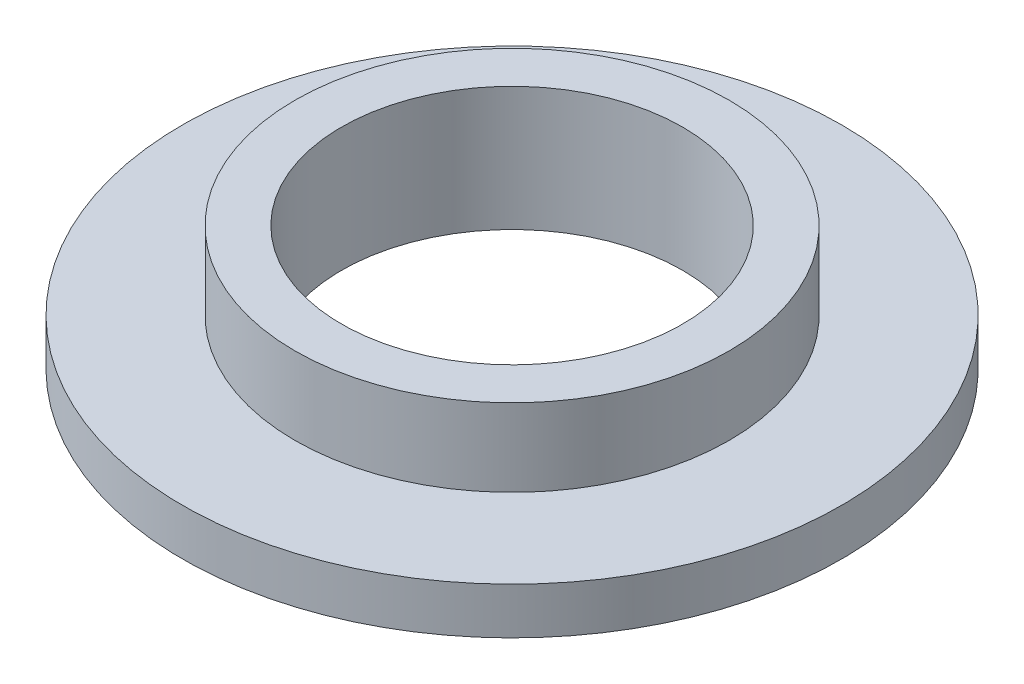
ISO-10303-21;
HEADER;
FILE_DESCRIPTION(('STEP AP214'),'2;1');
FILE_NAME('part.step','',(''),(''),'','','');
FILE_SCHEMA(('AUTOMOTIVE_DESIGN { 1 0 10303 214 1 1 1 1 }'));
ENDSEC;
DATA;
#1=APPLICATION_CONTEXT('core data for automotive mechanical design processes');
#2=APPLICATION_PROTOCOL_DEFINITION('international standard','automotive_design',2000,#1);
#3=PRODUCT_CONTEXT('',#1,'mechanical');
#4=PRODUCT('Part','Part','',(#3));
#5=PRODUCT_RELATED_PRODUCT_CATEGORY('part','',(#4));
#6=PRODUCT_DEFINITION_FORMATION('','',#4);
#7=PRODUCT_DEFINITION_CONTEXT('part definition',#1,'design');
#8=PRODUCT_DEFINITION('design','',#6,#7);
#9=PRODUCT_DEFINITION_SHAPE('','',#8);
#10=(LENGTH_UNIT() NAMED_UNIT(*) SI_UNIT(.MILLI.,.METRE.));
#11=(NAMED_UNIT(*) PLANE_ANGLE_UNIT() SI_UNIT($,.RADIAN.));
#12=(NAMED_UNIT(*) SI_UNIT($,.STERADIAN.) SOLID_ANGLE_UNIT());
#13=UNCERTAINTY_MEASURE_WITH_UNIT(LENGTH_MEASURE(1.E-05),#10,'distance_accuracy_value','');
#14=(GEOMETRIC_REPRESENTATION_CONTEXT(3) GLOBAL_UNCERTAINTY_ASSIGNED_CONTEXT((#13)) GLOBAL_UNIT_ASSIGNED_CONTEXT((#10,
#11,#12)) REPRESENTATION_CONTEXT('',''));
#15=CARTESIAN_POINT('',(0.,0.,0.));
#16=DIRECTION('',(0.,0.,1.));
#17=DIRECTION('',(1.,0.,0.));
#18=AXIS2_PLACEMENT_3D('',#15,#16,#17);
#19=CARTESIAN_POINT('',(-5.3975,0.,0.));
#20=DIRECTION('',(0.,1.,0.));
#21=DIRECTION('',(0.,0.,1.));
#22=AXIS2_PLACEMENT_3D('',#19,#20,#21);
#23=PLANE('',#22);
#24=CARTESIAN_POINT('',(0.,0.,0.));
#25=DIRECTION('',(0.,-1.,0.));
#26=DIRECTION('',(0.,0.,-1.));
#27=AXIS2_PLACEMENT_3D('',#24,#25,#26);
#28=CIRCLE('',#27,2.794);
#29=CARTESIAN_POINT('',(0.,0.,-2.794));
#30=VERTEX_POINT('',#29);
#31=EDGE_CURVE('E10',#30,#30,#28,.T.);
#32=ORIENTED_EDGE('',*,*,#31,.F.);
#33=EDGE_LOOP('',(#32));
#34=FACE_BOUND('',#33,.T.);
#35=CARTESIAN_POINT('',(0.,0.,0.));
#36=DIRECTION('',(0.,-1.,0.));
#37=DIRECTION('',(0.,0.,-1.));
#38=AXIS2_PLACEMENT_3D('',#35,#36,#37);
#39=CIRCLE('',#38,5.3975);
#40=CARTESIAN_POINT('',(0.,0.,-5.3975));
#41=VERTEX_POINT('',#40);
#42=EDGE_CURVE('E70',#41,#41,#39,.T.);
#43=ORIENTED_EDGE('',*,*,#42,.T.);
#44=EDGE_LOOP('',(#43));
#45=FACE_BOUND('',#44,.T.);
#46=ADVANCED_FACE('F43',(#34,#45),#23,.F.);
#47=CARTESIAN_POINT('',(0.,0.,0.));
#48=DIRECTION('',(0.,-1.,0.));
#49=DIRECTION('',(0.,0.,-1.));
#50=AXIS2_PLACEMENT_3D('',#47,#48,#49);
#51=CYLINDRICAL_SURFACE('',#50,2.794);
#52=CARTESIAN_POINT('',(0.,2.032,0.));
#53=DIRECTION('',(0.,-1.,0.));
#54=DIRECTION('',(0.,0.,-1.));
#55=AXIS2_PLACEMENT_3D('',#52,#53,#54);
#56=CIRCLE('',#55,2.794);
#57=CARTESIAN_POINT('',(0.,2.032,-2.794));
#58=VERTEX_POINT('',#57);
#59=EDGE_CURVE('E50',#58,#58,#56,.T.);
#60=ORIENTED_EDGE('',*,*,#59,.F.);
#61=EDGE_LOOP('',(#60));
#62=FACE_BOUND('',#61,.T.);
#63=ORIENTED_EDGE('',*,*,#31,.T.);
#64=EDGE_LOOP('',(#63));
#65=FACE_BOUND('',#64,.T.);
#66=ADVANCED_FACE('F96',(#62,#65),#51,.F.);
#67=CARTESIAN_POINT('',(-2.794,2.032,0.));
#68=DIRECTION('',(0.,-1.,0.));
#69=DIRECTION('',(0.,0.,-1.));
#70=AXIS2_PLACEMENT_3D('',#67,#68,#69);
#71=PLANE('',#70);
#72=CARTESIAN_POINT('',(0.,2.032,0.));
#73=DIRECTION('',(0.,-1.,0.));
#74=DIRECTION('',(0.,0.,-1.));
#75=AXIS2_PLACEMENT_3D('',#72,#73,#74);
#76=CIRCLE('',#75,3.556);
#77=CARTESIAN_POINT('',(0.,2.032,-3.556));
#78=VERTEX_POINT('',#77);
#79=EDGE_CURVE('E55',#78,#78,#76,.T.);
#80=ORIENTED_EDGE('',*,*,#79,.F.);
#81=EDGE_LOOP('',(#80));
#82=FACE_BOUND('',#81,.T.);
#83=ORIENTED_EDGE('',*,*,#59,.T.);
#84=EDGE_LOOP('',(#83));
#85=FACE_BOUND('',#84,.T.);
#86=ADVANCED_FACE('F91',(#82,#85),#71,.F.);
#87=CARTESIAN_POINT('',(0.,0.,0.));
#88=DIRECTION('',(0.,-1.,0.));
#89=DIRECTION('',(0.,0.,-1.));
#90=AXIS2_PLACEMENT_3D('',#87,#88,#89);
#91=CYLINDRICAL_SURFACE('',#90,3.556);
#92=CARTESIAN_POINT('',(0.,0.762,0.));
#93=DIRECTION('',(0.,-1.,0.));
#94=DIRECTION('',(0.,0.,-1.));
#95=AXIS2_PLACEMENT_3D('',#92,#93,#94);
#96=CIRCLE('',#95,3.556);
#97=CARTESIAN_POINT('',(0.,0.762,-3.556));
#98=VERTEX_POINT('',#97);
#99=EDGE_CURVE('E60',#98,#98,#96,.T.);
#100=ORIENTED_EDGE('',*,*,#99,.F.);
#101=EDGE_LOOP('',(#100));
#102=FACE_BOUND('',#101,.T.);
#103=ORIENTED_EDGE('',*,*,#79,.T.);
#104=EDGE_LOOP('',(#103));
#105=FACE_BOUND('',#104,.T.);
#106=ADVANCED_FACE('F85',(#102,#105),#91,.T.);
#107=CARTESIAN_POINT('',(-3.556,0.762,0.));
#108=DIRECTION('',(0.,-1.,0.));
#109=DIRECTION('',(0.,0.,-1.));
#110=AXIS2_PLACEMENT_3D('',#107,#108,#109);
#111=PLANE('',#110);
#112=CARTESIAN_POINT('',(0.,0.762,0.));
#113=DIRECTION('',(0.,-1.,0.));
#114=DIRECTION('',(0.,0.,-1.));
#115=AXIS2_PLACEMENT_3D('',#112,#113,#114);
#116=CIRCLE('',#115,5.3975);
#117=CARTESIAN_POINT('',(0.,0.762,-5.3975));
#118=VERTEX_POINT('',#117);
#119=EDGE_CURVE('E66',#118,#118,#116,.T.);
#120=ORIENTED_EDGE('',*,*,#119,.F.);
#121=EDGE_LOOP('',(#120));
#122=FACE_BOUND('',#121,.T.);
#123=ORIENTED_EDGE('',*,*,#99,.T.);
#124=EDGE_LOOP('',(#123));
#125=FACE_BOUND('',#124,.T.);
#126=ADVANCED_FACE('F79',(#122,#125),#111,.F.);
#127=CARTESIAN_POINT('',(0.,0.,0.));
#128=DIRECTION('',(0.,-1.,0.));
#129=DIRECTION('',(0.,0.,-1.));
#130=AXIS2_PLACEMENT_3D('',#127,#128,#129);
#131=CYLINDRICAL_SURFACE('',#130,5.3975);
#132=ORIENTED_EDGE('',*,*,#42,.F.);
#133=EDGE_LOOP('',(#132));
#134=FACE_BOUND('',#133,.T.);
#135=ORIENTED_EDGE('',*,*,#119,.T.);
#136=EDGE_LOOP('',(#135));
#137=FACE_BOUND('',#136,.T.);
#138=ADVANCED_FACE('F76',(#134,#137),#131,.T.);
#139=CLOSED_SHELL('',(#46,#66,#86,#106,#126,#138));
#140=MANIFOLD_SOLID_BREP('B2',#139);
#141=ADVANCED_BREP_SHAPE_REPRESENTATION('',(#18,#140),#14);
#142=SHAPE_DEFINITION_REPRESENTATION(#9,#141);
ENDSEC;
END-ISO-10303-21;
